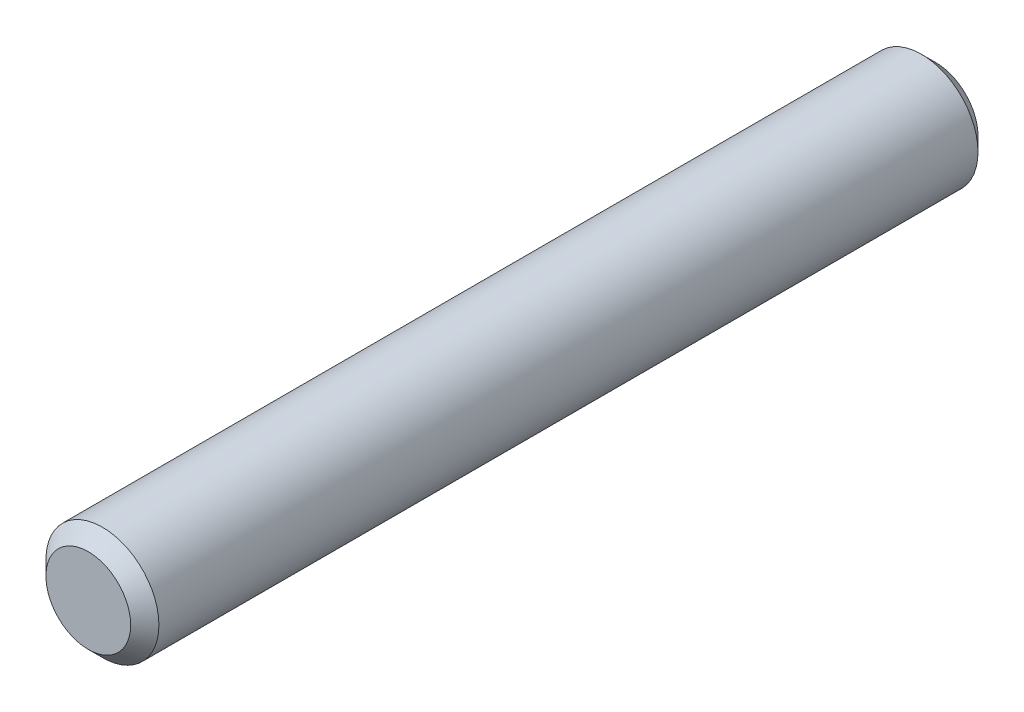
ISO-10303-21;
HEADER;
FILE_DESCRIPTION(('STEP AP214'),'2;1');
FILE_NAME('part.step','',(''),(''),'','','');
FILE_SCHEMA(('AUTOMOTIVE_DESIGN { 1 0 10303 214 1 1 1 1 }'));
ENDSEC;
DATA;
#1=APPLICATION_CONTEXT('core data for automotive mechanical design processes');
#2=APPLICATION_PROTOCOL_DEFINITION('international standard','automotive_design',2000,#1);
#3=PRODUCT_CONTEXT('',#1,'mechanical');
#4=PRODUCT('Part','Part','',(#3));
#5=PRODUCT_RELATED_PRODUCT_CATEGORY('part','',(#4));
#6=PRODUCT_DEFINITION_FORMATION('','',#4);
#7=PRODUCT_DEFINITION_CONTEXT('part definition',#1,'design');
#8=PRODUCT_DEFINITION('design','',#6,#7);
#9=PRODUCT_DEFINITION_SHAPE('','',#8);
#10=(LENGTH_UNIT() NAMED_UNIT(*) SI_UNIT(.MILLI.,.METRE.));
#11=(NAMED_UNIT(*) PLANE_ANGLE_UNIT() SI_UNIT($,.RADIAN.));
#12=(NAMED_UNIT(*) SI_UNIT($,.STERADIAN.) SOLID_ANGLE_UNIT());
#13=UNCERTAINTY_MEASURE_WITH_UNIT(LENGTH_MEASURE(1.E-05),#10,'distance_accuracy_value','');
#14=(GEOMETRIC_REPRESENTATION_CONTEXT(3) GLOBAL_UNCERTAINTY_ASSIGNED_CONTEXT((#13)) GLOBAL_UNIT_ASSIGNED_CONTEXT((#10,
#11,#12)) REPRESENTATION_CONTEXT('',''));
#15=CARTESIAN_POINT('',(0.,0.,0.));
#16=DIRECTION('',(0.,0.,1.));
#17=DIRECTION('',(1.,0.,0.));
#18=AXIS2_PLACEMENT_3D('',#15,#16,#17);
#19=CARTESIAN_POINT('',(0.,0.,15.));
#20=DIRECTION('',(0.,0.,-1.));
#21=DIRECTION('',(-1.,0.,0.));
#22=AXIS2_PLACEMENT_3D('',#19,#20,#21);
#23=CYLINDRICAL_SURFACE('',#22,2.);
#24=CARTESIAN_POINT('',(0.,0.,14.5));
#25=DIRECTION('',(0.,0.,1.));
#26=DIRECTION('',(1.,0.,0.));
#27=AXIS2_PLACEMENT_3D('',#24,#25,#26);
#28=CIRCLE('',#27,2.);
#29=CARTESIAN_POINT('',(2.,0.,14.5));
#30=VERTEX_POINT('',#29);
#31=EDGE_CURVE('E38',#30,#30,#28,.F.);
#32=ORIENTED_EDGE('',*,*,#31,.T.);
#33=EDGE_LOOP('',(#32));
#34=FACE_BOUND('',#33,.T.);
#35=CARTESIAN_POINT('',(0.,0.,-14.5));
#36=DIRECTION('',(0.,0.,1.));
#37=DIRECTION('',(1.,0.,0.));
#38=AXIS2_PLACEMENT_3D('',#35,#36,#37);
#39=CIRCLE('',#38,2.);
#40=CARTESIAN_POINT('',(2.,0.,-14.5));
#41=VERTEX_POINT('',#40);
#42=EDGE_CURVE('E42',#41,#41,#39,.T.);
#43=ORIENTED_EDGE('',*,*,#42,.T.);
#44=EDGE_LOOP('',(#43));
#45=FACE_BOUND('',#44,.T.);
#46=ADVANCED_FACE('F31',(#34,#45),#23,.T.);
#47=CARTESIAN_POINT('',(0.,0.,15.));
#48=DIRECTION('',(0.,0.,1.));
#49=DIRECTION('',(1.,0.,0.));
#50=AXIS2_PLACEMENT_3D('',#47,#48,#49);
#51=PLANE('',#50);
#52=CARTESIAN_POINT('',(0.,0.,15.));
#53=DIRECTION('',(0.,0.,1.));
#54=DIRECTION('',(1.,0.,0.));
#55=AXIS2_PLACEMENT_3D('',#52,#53,#54);
#56=CIRCLE('',#55,1.5);
#57=CARTESIAN_POINT('',(1.5,0.,15.));
#58=VERTEX_POINT('',#57);
#59=EDGE_CURVE('E46',#58,#58,#56,.T.);
#60=ORIENTED_EDGE('',*,*,#59,.T.);
#61=EDGE_LOOP('',(#60));
#62=FACE_BOUND('',#61,.T.);
#63=ADVANCED_FACE('F52',(#62),#51,.T.);
#64=CARTESIAN_POINT('',(0.,0.,-15.));
#65=DIRECTION('',(0.,0.,1.));
#66=DIRECTION('',(1.,0.,0.));
#67=AXIS2_PLACEMENT_3D('',#64,#65,#66);
#68=PLANE('',#67);
#69=CARTESIAN_POINT('',(0.,0.,-15.));
#70=DIRECTION('',(0.,0.,1.));
#71=DIRECTION('',(1.,0.,0.));
#72=AXIS2_PLACEMENT_3D('',#69,#70,#71);
#73=CIRCLE('',#72,1.5);
#74=CARTESIAN_POINT('',(1.5,0.,-15.));
#75=VERTEX_POINT('',#74);
#76=EDGE_CURVE('E10',#75,#75,#73,.F.);
#77=ORIENTED_EDGE('',*,*,#76,.T.);
#78=EDGE_LOOP('',(#77));
#79=FACE_BOUND('',#78,.T.);
#80=ADVANCED_FACE('F56',(#79),#68,.F.);
#81=CARTESIAN_POINT('',(0.,0.,15.));
#82=DIRECTION('',(0.,0.,-1.));
#83=DIRECTION('',(-1.,0.,0.));
#84=AXIS2_PLACEMENT_3D('',#81,#82,#83);
#85=CONICAL_SURFACE('',#84,1.5,0.785398163397448);
#86=ORIENTED_EDGE('',*,*,#31,.F.);
#87=EDGE_LOOP('',(#86));
#88=FACE_BOUND('',#87,.T.);
#89=ORIENTED_EDGE('',*,*,#59,.F.);
#90=EDGE_LOOP('',(#89));
#91=FACE_BOUND('',#90,.T.);
#92=ADVANCED_FACE('F54',(#88,#91),#85,.T.);
#93=CARTESIAN_POINT('',(0.,0.,-14.5));
#94=DIRECTION('',(0.,0.,1.));
#95=DIRECTION('',(1.,0.,0.));
#96=AXIS2_PLACEMENT_3D('',#93,#94,#95);
#97=CONICAL_SURFACE('',#96,2.,0.78539816339745);
#98=ORIENTED_EDGE('',*,*,#76,.F.);
#99=EDGE_LOOP('',(#98));
#100=FACE_BOUND('',#99,.T.);
#101=ORIENTED_EDGE('',*,*,#42,.F.);
#102=EDGE_LOOP('',(#101));
#103=FACE_BOUND('',#102,.T.);
#104=ADVANCED_FACE('F33',(#100,#103),#97,.T.);
#105=CLOSED_SHELL('',(#46,#63,#80,#92,#104));
#106=MANIFOLD_SOLID_BREP('B2',#105);
#107=ADVANCED_BREP_SHAPE_REPRESENTATION('',(#18,#106),#14);
#108=SHAPE_DEFINITION_REPRESENTATION(#9,#107);
ENDSEC;
END-ISO-10303-21;
